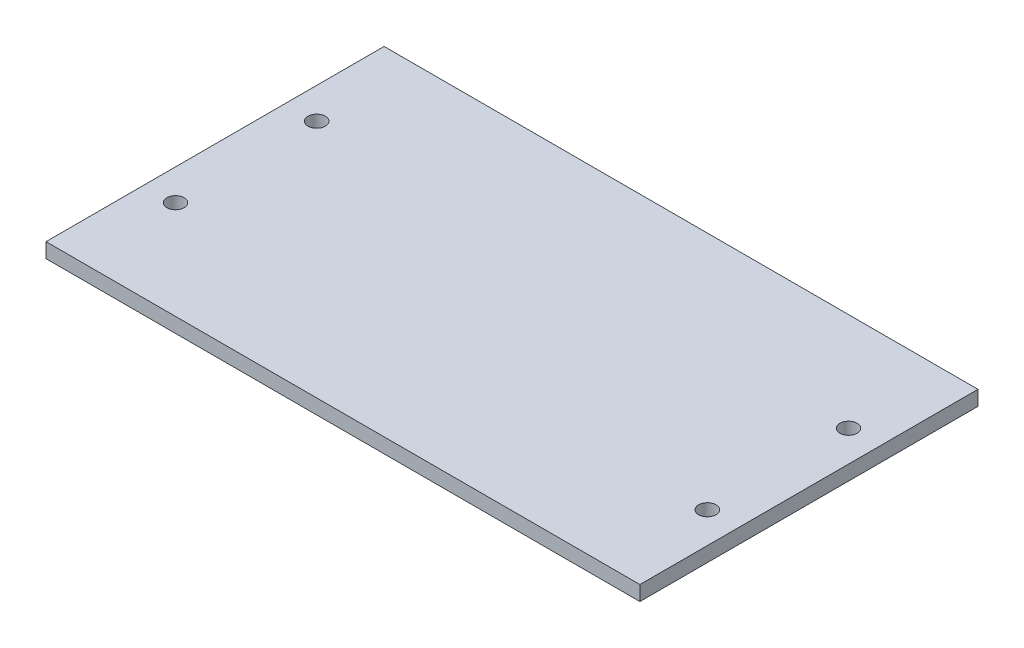
ISO-10303-21;
HEADER;
FILE_DESCRIPTION(('STEP AP214'),'2;1');
FILE_NAME('part.step','',(''),(''),'','','');
FILE_SCHEMA(('AUTOMOTIVE_DESIGN { 1 0 10303 214 1 1 1 1 }'));
ENDSEC;
DATA;
#1=APPLICATION_CONTEXT('core data for automotive mechanical design processes');
#2=APPLICATION_PROTOCOL_DEFINITION('international standard','automotive_design',2000,#1);
#3=PRODUCT_CONTEXT('',#1,'mechanical');
#4=PRODUCT('Part','Part','',(#3));
#5=PRODUCT_RELATED_PRODUCT_CATEGORY('part','',(#4));
#6=PRODUCT_DEFINITION_FORMATION('','',#4);
#7=PRODUCT_DEFINITION_CONTEXT('part definition',#1,'design');
#8=PRODUCT_DEFINITION('design','',#6,#7);
#9=PRODUCT_DEFINITION_SHAPE('','',#8);
#10=(LENGTH_UNIT() NAMED_UNIT(*) SI_UNIT(.MILLI.,.METRE.));
#11=(NAMED_UNIT(*) PLANE_ANGLE_UNIT() SI_UNIT($,.RADIAN.));
#12=(NAMED_UNIT(*) SI_UNIT($,.STERADIAN.) SOLID_ANGLE_UNIT());
#13=UNCERTAINTY_MEASURE_WITH_UNIT(LENGTH_MEASURE(1.E-05),#10,'distance_accuracy_value','');
#14=(GEOMETRIC_REPRESENTATION_CONTEXT(3) GLOBAL_UNCERTAINTY_ASSIGNED_CONTEXT((#13)) GLOBAL_UNIT_ASSIGNED_CONTEXT((#10,
#11,#12)) REPRESENTATION_CONTEXT('',''));
#15=CARTESIAN_POINT('',(0.,0.,0.));
#16=DIRECTION('',(0.,0.,1.));
#17=DIRECTION('',(1.,0.,0.));
#18=AXIS2_PLACEMENT_3D('',#15,#16,#17);
#19=CARTESIAN_POINT('',(0.,4.7625,0.));
#20=DIRECTION('',(0.,-1.,0.));
#21=DIRECTION('',(0.,0.,-1.));
#22=AXIS2_PLACEMENT_3D('',#19,#20,#21);
#23=PLANE('',#22);
#24=DIRECTION('',(0.,0.,1.));
#25=VECTOR('',#24,1.);
#26=CARTESIAN_POINT('',(0.,4.7625,0.));
#27=LINE('',#26,#25);
#28=CARTESIAN_POINT('',(0.,4.7625,-109.0295));
#29=VERTEX_POINT('',#28);
#30=CARTESIAN_POINT('',(0.,4.7625,0.));
#31=VERTEX_POINT('',#30);
#32=EDGE_CURVE('E88',#29,#31,#27,.T.);
#33=ORIENTED_EDGE('',*,*,#32,.T.);
#34=DIRECTION('',(1.,0.,0.));
#35=VECTOR('',#34,1.);
#36=CARTESIAN_POINT('',(0.,4.7625,0.));
#37=LINE('',#36,#35);
#38=CARTESIAN_POINT('',(191.516,4.7625,0.));
#39=VERTEX_POINT('',#38);
#40=EDGE_CURVE('E83',#31,#39,#37,.T.);
#41=ORIENTED_EDGE('',*,*,#40,.T.);
#42=DIRECTION('',(0.,0.,-1.));
#43=VECTOR('',#42,1.);
#44=CARTESIAN_POINT('',(191.516,4.7625,0.));
#45=LINE('',#44,#43);
#46=CARTESIAN_POINT('',(191.516,4.7625,-109.0295));
#47=VERTEX_POINT('',#46);
#48=EDGE_CURVE('E86',#39,#47,#45,.T.);
#49=ORIENTED_EDGE('',*,*,#48,.T.);
#50=DIRECTION('',(-1.,0.,0.));
#51=VECTOR('',#50,1.);
#52=CARTESIAN_POINT('',(0.,4.7625,-109.0295));
#53=LINE('',#52,#51);
#54=EDGE_CURVE('E53',#47,#29,#53,.T.);
#55=ORIENTED_EDGE('',*,*,#54,.T.);
#56=EDGE_LOOP('',(#33,#41,#49,#55));
#57=FACE_BOUND('',#56,.T.);
#58=CARTESIAN_POINT('',(10.0076,4.7625,-77.2795));
#59=DIRECTION('',(0.,1.,0.));
#60=DIRECTION('',(0.,0.,1.));
#61=AXIS2_PLACEMENT_3D('',#58,#59,#60);
#62=CIRCLE('',#61,2.79400000000001);
#63=CARTESIAN_POINT('',(10.0076,4.7625,-80.0735));
#64=VERTEX_POINT('',#63);
#65=EDGE_CURVE('E103',#64,#64,#62,.T.);
#66=ORIENTED_EDGE('',*,*,#65,.F.);
#67=EDGE_LOOP('',(#66));
#68=FACE_BOUND('',#67,.T.);
#69=CARTESIAN_POINT('',(10.0076,4.7625,-31.75));
#70=DIRECTION('',(0.,1.,0.));
#71=DIRECTION('',(0.,0.,1.));
#72=AXIS2_PLACEMENT_3D('',#69,#70,#71);
#73=CIRCLE('',#72,2.794);
#74=CARTESIAN_POINT('',(10.0076,4.7625,-34.544));
#75=VERTEX_POINT('',#74);
#76=EDGE_CURVE('E118',#75,#75,#73,.T.);
#77=ORIENTED_EDGE('',*,*,#76,.F.);
#78=EDGE_LOOP('',(#77));
#79=FACE_BOUND('',#78,.T.);
#80=CARTESIAN_POINT('',(181.5084,4.7625,-77.2795));
#81=DIRECTION('',(0.,1.,0.));
#82=DIRECTION('',(0.,0.,1.));
#83=AXIS2_PLACEMENT_3D('',#80,#81,#82);
#84=CIRCLE('',#83,2.79399999999998);
#85=CARTESIAN_POINT('',(181.5084,4.7625,-80.0735));
#86=VERTEX_POINT('',#85);
#87=EDGE_CURVE('E124',#86,#86,#84,.T.);
#88=ORIENTED_EDGE('',*,*,#87,.F.);
#89=EDGE_LOOP('',(#88));
#90=FACE_BOUND('',#89,.T.);
#91=CARTESIAN_POINT('',(181.5084,4.7625,-31.75));
#92=DIRECTION('',(0.,1.,0.));
#93=DIRECTION('',(0.,0.,1.));
#94=AXIS2_PLACEMENT_3D('',#91,#92,#93);
#95=CIRCLE('',#94,2.79399999999998);
#96=CARTESIAN_POINT('',(181.5084,4.7625,-34.544));
#97=VERTEX_POINT('',#96);
#98=EDGE_CURVE('E130',#97,#97,#95,.T.);
#99=ORIENTED_EDGE('',*,*,#98,.F.);
#100=EDGE_LOOP('',(#99));
#101=FACE_BOUND('',#100,.T.);
#102=ADVANCED_FACE('F36',(#57,#68,#79,#90,#101),#23,.F.);
#103=CARTESIAN_POINT('',(0.,0.,0.));
#104=DIRECTION('',(0.,-1.,0.));
#105=DIRECTION('',(0.,0.,-1.));
#106=AXIS2_PLACEMENT_3D('',#103,#104,#105);
#107=PLANE('',#106);
#108=CARTESIAN_POINT('',(181.5084,0.,-77.2795));
#109=DIRECTION('',(0.,1.,0.));
#110=DIRECTION('',(0.,0.,1.));
#111=AXIS2_PLACEMENT_3D('',#108,#109,#110);
#112=CIRCLE('',#111,2.79399999999998);
#113=CARTESIAN_POINT('',(181.5084,0.,-80.0735));
#114=VERTEX_POINT('',#113);
#115=EDGE_CURVE('E127',#114,#114,#112,.T.);
#116=ORIENTED_EDGE('',*,*,#115,.T.);
#117=EDGE_LOOP('',(#116));
#118=FACE_BOUND('',#117,.T.);
#119=CARTESIAN_POINT('',(10.0076,0.,-77.2795));
#120=DIRECTION('',(0.,1.,0.));
#121=DIRECTION('',(0.,0.,1.));
#122=AXIS2_PLACEMENT_3D('',#119,#120,#121);
#123=CIRCLE('',#122,2.79400000000001);
#124=CARTESIAN_POINT('',(10.0076,0.,-80.0735));
#125=VERTEX_POINT('',#124);
#126=EDGE_CURVE('E115',#125,#125,#123,.T.);
#127=ORIENTED_EDGE('',*,*,#126,.T.);
#128=EDGE_LOOP('',(#127));
#129=FACE_BOUND('',#128,.T.);
#130=DIRECTION('',(0.,0.,1.));
#131=VECTOR('',#130,1.);
#132=CARTESIAN_POINT('',(0.,0.,0.));
#133=LINE('',#132,#131);
#134=CARTESIAN_POINT('',(0.,0.,-109.0295));
#135=VERTEX_POINT('',#134);
#136=CARTESIAN_POINT('',(0.,0.,0.));
#137=VERTEX_POINT('',#136);
#138=EDGE_CURVE('E100',#135,#137,#133,.T.);
#139=ORIENTED_EDGE('',*,*,#138,.F.);
#140=DIRECTION('',(-1.,0.,0.));
#141=VECTOR('',#140,1.);
#142=CARTESIAN_POINT('',(0.,0.,-109.0295));
#143=LINE('',#142,#141);
#144=CARTESIAN_POINT('',(191.516,0.,-109.0295));
#145=VERTEX_POINT('',#144);
#146=EDGE_CURVE('E76',#145,#135,#143,.T.);
#147=ORIENTED_EDGE('',*,*,#146,.F.);
#148=DIRECTION('',(0.,0.,-1.));
#149=VECTOR('',#148,1.);
#150=CARTESIAN_POINT('',(191.516,0.,0.));
#151=LINE('',#150,#149);
#152=CARTESIAN_POINT('',(191.516,0.,0.));
#153=VERTEX_POINT('',#152);
#154=EDGE_CURVE('E70',#153,#145,#151,.T.);
#155=ORIENTED_EDGE('',*,*,#154,.F.);
#156=DIRECTION('',(1.,0.,0.));
#157=VECTOR('',#156,1.);
#158=CARTESIAN_POINT('',(0.,0.,0.));
#159=LINE('',#158,#157);
#160=EDGE_CURVE('E92',#137,#153,#159,.T.);
#161=ORIENTED_EDGE('',*,*,#160,.F.);
#162=EDGE_LOOP('',(#139,#147,#155,#161));
#163=FACE_BOUND('',#162,.T.);
#164=CARTESIAN_POINT('',(10.0076,0.,-31.75));
#165=DIRECTION('',(0.,1.,0.));
#166=DIRECTION('',(0.,0.,1.));
#167=AXIS2_PLACEMENT_3D('',#164,#165,#166);
#168=CIRCLE('',#167,2.794);
#169=CARTESIAN_POINT('',(10.0076,0.,-34.544));
#170=VERTEX_POINT('',#169);
#171=EDGE_CURVE('E121',#170,#170,#168,.T.);
#172=ORIENTED_EDGE('',*,*,#171,.T.);
#173=EDGE_LOOP('',(#172));
#174=FACE_BOUND('',#173,.T.);
#175=CARTESIAN_POINT('',(181.5084,0.,-31.75));
#176=DIRECTION('',(0.,1.,0.));
#177=DIRECTION('',(0.,0.,1.));
#178=AXIS2_PLACEMENT_3D('',#175,#176,#177);
#179=CIRCLE('',#178,2.79399999999998);
#180=CARTESIAN_POINT('',(181.5084,0.,-34.544));
#181=VERTEX_POINT('',#180);
#182=EDGE_CURVE('E133',#181,#181,#179,.T.);
#183=ORIENTED_EDGE('',*,*,#182,.T.);
#184=EDGE_LOOP('',(#183));
#185=FACE_BOUND('',#184,.T.);
#186=ADVANCED_FACE('F111',(#118,#129,#163,#174,#185),#107,.T.);
#187=CARTESIAN_POINT('',(0.,4.7625,0.));
#188=DIRECTION('',(1.,0.,0.));
#189=DIRECTION('',(0.,0.,-1.));
#190=AXIS2_PLACEMENT_3D('',#187,#188,#189);
#191=PLANE('',#190);
#192=ORIENTED_EDGE('',*,*,#138,.T.);
#193=DIRECTION('',(0.,-1.,0.));
#194=VECTOR('',#193,1.);
#195=CARTESIAN_POINT('',(0.,4.7625,0.));
#196=LINE('',#195,#194);
#197=EDGE_CURVE('E11',#31,#137,#196,.T.);
#198=ORIENTED_EDGE('',*,*,#197,.F.);
#199=ORIENTED_EDGE('',*,*,#32,.F.);
#200=DIRECTION('',(0.,-1.,0.));
#201=VECTOR('',#200,1.);
#202=CARTESIAN_POINT('',(0.,4.7625,-109.0295));
#203=LINE('',#202,#201);
#204=EDGE_CURVE('E96',#29,#135,#203,.T.);
#205=ORIENTED_EDGE('',*,*,#204,.T.);
#206=EDGE_LOOP('',(#192,#198,#199,#205));
#207=FACE_BOUND('',#206,.T.);
#208=ADVANCED_FACE('F38',(#207),#191,.F.);
#209=CARTESIAN_POINT('',(0.,4.7625,0.));
#210=DIRECTION('',(0.,0.,-1.));
#211=DIRECTION('',(-1.,0.,0.));
#212=AXIS2_PLACEMENT_3D('',#209,#210,#211);
#213=PLANE('',#212);
#214=ORIENTED_EDGE('',*,*,#160,.T.);
#215=DIRECTION('',(0.,-1.,0.));
#216=VECTOR('',#215,1.);
#217=CARTESIAN_POINT('',(191.516,4.7625,0.));
#218=LINE('',#217,#216);
#219=EDGE_CURVE('E45',#39,#153,#218,.T.);
#220=ORIENTED_EDGE('',*,*,#219,.F.);
#221=ORIENTED_EDGE('',*,*,#40,.F.);
#222=ORIENTED_EDGE('',*,*,#197,.T.);
#223=EDGE_LOOP('',(#214,#220,#221,#222));
#224=FACE_BOUND('',#223,.T.);
#225=ADVANCED_FACE('F91',(#224),#213,.F.);
#226=CARTESIAN_POINT('',(191.516,4.7625,0.));
#227=DIRECTION('',(-1.,0.,0.));
#228=DIRECTION('',(0.,0.,1.));
#229=AXIS2_PLACEMENT_3D('',#226,#227,#228);
#230=PLANE('',#229);
#231=ORIENTED_EDGE('',*,*,#154,.T.);
#232=DIRECTION('',(0.,-1.,0.));
#233=VECTOR('',#232,1.);
#234=CARTESIAN_POINT('',(191.516,4.7625,-109.0295));
#235=LINE('',#234,#233);
#236=EDGE_CURVE('E93',#47,#145,#235,.T.);
#237=ORIENTED_EDGE('',*,*,#236,.F.);
#238=ORIENTED_EDGE('',*,*,#48,.F.);
#239=ORIENTED_EDGE('',*,*,#219,.T.);
#240=EDGE_LOOP('',(#231,#237,#238,#239));
#241=FACE_BOUND('',#240,.T.);
#242=ADVANCED_FACE('F94',(#241),#230,.F.);
#243=CARTESIAN_POINT('',(0.,4.7625,-109.0295));
#244=DIRECTION('',(0.,0.,1.));
#245=DIRECTION('',(1.,0.,0.));
#246=AXIS2_PLACEMENT_3D('',#243,#244,#245);
#247=PLANE('',#246);
#248=ORIENTED_EDGE('',*,*,#146,.T.);
#249=ORIENTED_EDGE('',*,*,#204,.F.);
#250=ORIENTED_EDGE('',*,*,#54,.F.);
#251=ORIENTED_EDGE('',*,*,#236,.T.);
#252=EDGE_LOOP('',(#248,#249,#250,#251));
#253=FACE_BOUND('',#252,.T.);
#254=ADVANCED_FACE('F108',(#253),#247,.F.);
#255=CARTESIAN_POINT('',(10.0076,4.7625,-77.2795));
#256=DIRECTION('',(0.,-1.,0.));
#257=DIRECTION('',(0.,0.,-1.));
#258=AXIS2_PLACEMENT_3D('',#255,#256,#257);
#259=CYLINDRICAL_SURFACE('',#258,2.79400000000001);
#260=CARTESIAN_POINT('',(10.0076,4.7625,-80.0735));
#261=CARTESIAN_POINT('',(10.0076,4.712890625,-80.0735));
#262=CARTESIAN_POINT('',(10.0076,4.66328125,-80.0735));
#263=CARTESIAN_POINT('',(10.0076,4.5640625,-80.0735));
#264=CARTESIAN_POINT('',(10.0076,4.514453125,-80.0735));
#265=CARTESIAN_POINT('',(10.0076,4.415234375,-80.0735));
#266=CARTESIAN_POINT('',(10.0076,4.365625,-80.0735));
#267=CARTESIAN_POINT('',(10.0076,4.26640625,-80.0735));
#268=CARTESIAN_POINT('',(10.0076,4.216796875,-80.0735));
#269=CARTESIAN_POINT('',(10.0076,4.117578125,-80.0735));
#270=CARTESIAN_POINT('',(10.0076,4.06796875,-80.0735));
#271=CARTESIAN_POINT('',(10.0076,3.96875,-80.0735));
#272=CARTESIAN_POINT('',(10.0076,3.919140625,-80.0735));
#273=CARTESIAN_POINT('',(10.0076,3.819921875,-80.0735));
#274=CARTESIAN_POINT('',(10.0076,3.7703125,-80.0735));
#275=CARTESIAN_POINT('',(10.0076,3.67109375,-80.0735));
#276=CARTESIAN_POINT('',(10.0076,3.621484375,-80.0735));
#277=CARTESIAN_POINT('',(10.0076,3.522265625,-80.0735));
#278=CARTESIAN_POINT('',(10.0076,3.47265625,-80.0735));
#279=CARTESIAN_POINT('',(10.0076,3.3734375,-80.0735));
#280=CARTESIAN_POINT('',(10.0076,3.323828125,-80.0735));
#281=CARTESIAN_POINT('',(10.0076,3.224609375,-80.0735));
#282=CARTESIAN_POINT('',(10.0076,3.175,-80.0735));
#283=CARTESIAN_POINT('',(10.0076,3.07578125,-80.0735));
#284=CARTESIAN_POINT('',(10.0076,3.026171875,-80.0735));
#285=CARTESIAN_POINT('',(10.0076,2.926953125,-80.0735));
#286=CARTESIAN_POINT('',(10.0076,2.87734375,-80.0735));
#287=CARTESIAN_POINT('',(10.0076,2.778125,-80.0735));
#288=CARTESIAN_POINT('',(10.0076,2.728515625,-80.0735));
#289=CARTESIAN_POINT('',(10.0076,2.629296875,-80.0735));
#290=CARTESIAN_POINT('',(10.0076,2.5796875,-80.0735));
#291=CARTESIAN_POINT('',(10.0076,2.48046875,-80.0735));
#292=CARTESIAN_POINT('',(10.0076,2.430859375,-80.0735));
#293=CARTESIAN_POINT('',(10.0076,2.331640625,-80.0735));
#294=CARTESIAN_POINT('',(10.0076,2.28203125,-80.0735));
#295=CARTESIAN_POINT('',(10.0076,2.1828125,-80.0735));
#296=CARTESIAN_POINT('',(10.0076,2.133203125,-80.0735));
#297=CARTESIAN_POINT('',(10.0076,2.033984375,-80.0735));
#298=CARTESIAN_POINT('',(10.0076,1.984375,-80.0735));
#299=CARTESIAN_POINT('',(10.0076,1.88515625,-80.0735));
#300=CARTESIAN_POINT('',(10.0076,1.835546875,-80.0735));
#301=CARTESIAN_POINT('',(10.0076,1.736328125,-80.0735));
#302=CARTESIAN_POINT('',(10.0076,1.68671875,-80.0735));
#303=CARTESIAN_POINT('',(10.0076,1.5875,-80.0735));
#304=CARTESIAN_POINT('',(10.0076,1.537890625,-80.0735));
#305=CARTESIAN_POINT('',(10.0076,1.438671875,-80.0735));
#306=CARTESIAN_POINT('',(10.0076,1.3890625,-80.0735));
#307=CARTESIAN_POINT('',(10.0076,1.28984375,-80.0735));
#308=CARTESIAN_POINT('',(10.0076,1.240234375,-80.0735));
#309=CARTESIAN_POINT('',(10.0076,1.141015625,-80.0735));
#310=CARTESIAN_POINT('',(10.0076,1.09140625,-80.0735));
#311=CARTESIAN_POINT('',(10.0076,0.9921875,-80.0735));
#312=CARTESIAN_POINT('',(10.0076,0.942578125,-80.0735));
#313=CARTESIAN_POINT('',(10.0076,0.843359375,-80.0735));
#314=CARTESIAN_POINT('',(10.0076,0.79375,-80.0735));
#315=CARTESIAN_POINT('',(10.0076,0.69453125,-80.0735));
#316=CARTESIAN_POINT('',(10.0076,0.644921875,-80.0735));
#317=CARTESIAN_POINT('',(10.0076,0.545703125,-80.0735));
#318=CARTESIAN_POINT('',(10.0076,0.49609375,-80.0735));
#319=CARTESIAN_POINT('',(10.0076,0.396875,-80.0735));
#320=CARTESIAN_POINT('',(10.0076,0.347265625,-80.0735));
#321=CARTESIAN_POINT('',(10.0076,0.248046875,-80.0735));
#322=CARTESIAN_POINT('',(10.0076,0.1984375,-80.0735));
#323=CARTESIAN_POINT('',(10.0076,0.09921875,-80.0735));
#324=CARTESIAN_POINT('',(10.0076,0.049609375,-80.0735));
#325=CARTESIAN_POINT('',(10.0076,0.,-80.0735));
#326=B_SPLINE_CURVE_WITH_KNOTS('',3,(#260,#261,#262,#263,#264,#265,#266,#267,#268,#269,#270,
#271,#272,#273,#274,#275,#276,#277,#278,#279,#280,#281,#282,#283,#284,#285,#286,#287,#288,#289,
#290,#291,#292,#293,#294,#295,#296,#297,#298,#299,#300,#301,#302,#303,#304,#305,#306,#307,#308,
#309,#310,#311,#312,#313,#314,#315,#316,#317,#318,#319,#320,#321,#322,#323,#324,#325),
.UNSPECIFIED.,.F.,.F.,(4,2,2,2,2,2,2,2,2,2,2,2,2,2,2,2,2,2,2,2,2,2,2,2,2,2,2,2,2,2,2,2,4),(0.,
0.148828124999999,0.297656249999999,0.446484374999999,0.595312499999999,0.744140625,0.89296875,
1.041796875,1.190625,1.339453125,1.48828125,1.637109375,1.7859375,1.934765625,2.08359375,
2.232421875,2.38125,2.530078125,2.67890625,2.827734375,2.9765625,3.125390625,3.27421875,
3.423046875,3.571875,3.720703125,3.86953125,4.018359375,4.1671875,4.316015625,4.46484375,
4.613671875,4.7625),.UNSPECIFIED.);
#327=EDGE_CURVE('BSEAM150',#64,#125,#326,.T.);
#328=ORIENTED_EDGE('',*,*,#65,.T.);
#329=ORIENTED_EDGE('',*,*,#126,.F.);
#330=ORIENTED_EDGE('',*,*,#327,.T.);
#331=ORIENTED_EDGE('',*,*,#327,.F.);
#332=EDGE_LOOP('',(#328,#330,#329,#331));
#333=FACE_BOUND('',#332,.T.);
#334=ADVANCED_FACE('F150',(#333),#259,.F.);
#335=CARTESIAN_POINT('',(10.0076,4.7625,-31.75));
#336=DIRECTION('',(0.,-1.,0.));
#337=DIRECTION('',(0.,0.,-1.));
#338=AXIS2_PLACEMENT_3D('',#335,#336,#337);
#339=CYLINDRICAL_SURFACE('',#338,2.794);
#340=CARTESIAN_POINT('',(10.0076,4.7625,-34.544));
#341=CARTESIAN_POINT('',(10.0076,4.712890625,-34.544));
#342=CARTESIAN_POINT('',(10.0076,4.66328125,-34.544));
#343=CARTESIAN_POINT('',(10.0076,4.5640625,-34.544));
#344=CARTESIAN_POINT('',(10.0076,4.514453125,-34.544));
#345=CARTESIAN_POINT('',(10.0076,4.415234375,-34.544));
#346=CARTESIAN_POINT('',(10.0076,4.365625,-34.544));
#347=CARTESIAN_POINT('',(10.0076,4.26640625,-34.544));
#348=CARTESIAN_POINT('',(10.0076,4.216796875,-34.544));
#349=CARTESIAN_POINT('',(10.0076,4.117578125,-34.544));
#350=CARTESIAN_POINT('',(10.0076,4.06796875,-34.544));
#351=CARTESIAN_POINT('',(10.0076,3.96875,-34.544));
#352=CARTESIAN_POINT('',(10.0076,3.919140625,-34.544));
#353=CARTESIAN_POINT('',(10.0076,3.819921875,-34.544));
#354=CARTESIAN_POINT('',(10.0076,3.7703125,-34.544));
#355=CARTESIAN_POINT('',(10.0076,3.67109375,-34.544));
#356=CARTESIAN_POINT('',(10.0076,3.621484375,-34.544));
#357=CARTESIAN_POINT('',(10.0076,3.522265625,-34.544));
#358=CARTESIAN_POINT('',(10.0076,3.47265625,-34.544));
#359=CARTESIAN_POINT('',(10.0076,3.3734375,-34.544));
#360=CARTESIAN_POINT('',(10.0076,3.323828125,-34.544));
#361=CARTESIAN_POINT('',(10.0076,3.224609375,-34.544));
#362=CARTESIAN_POINT('',(10.0076,3.175,-34.544));
#363=CARTESIAN_POINT('',(10.0076,3.07578125,-34.544));
#364=CARTESIAN_POINT('',(10.0076,3.026171875,-34.544));
#365=CARTESIAN_POINT('',(10.0076,2.926953125,-34.544));
#366=CARTESIAN_POINT('',(10.0076,2.87734375,-34.544));
#367=CARTESIAN_POINT('',(10.0076,2.778125,-34.544));
#368=CARTESIAN_POINT('',(10.0076,2.728515625,-34.544));
#369=CARTESIAN_POINT('',(10.0076,2.629296875,-34.544));
#370=CARTESIAN_POINT('',(10.0076,2.5796875,-34.544));
#371=CARTESIAN_POINT('',(10.0076,2.48046875,-34.544));
#372=CARTESIAN_POINT('',(10.0076,2.430859375,-34.544));
#373=CARTESIAN_POINT('',(10.0076,2.331640625,-34.544));
#374=CARTESIAN_POINT('',(10.0076,2.28203125,-34.544));
#375=CARTESIAN_POINT('',(10.0076,2.1828125,-34.544));
#376=CARTESIAN_POINT('',(10.0076,2.133203125,-34.544));
#377=CARTESIAN_POINT('',(10.0076,2.033984375,-34.544));
#378=CARTESIAN_POINT('',(10.0076,1.984375,-34.544));
#379=CARTESIAN_POINT('',(10.0076,1.88515625,-34.544));
#380=CARTESIAN_POINT('',(10.0076,1.835546875,-34.544));
#381=CARTESIAN_POINT('',(10.0076,1.736328125,-34.544));
#382=CARTESIAN_POINT('',(10.0076,1.68671875,-34.544));
#383=CARTESIAN_POINT('',(10.0076,1.5875,-34.544));
#384=CARTESIAN_POINT('',(10.0076,1.537890625,-34.544));
#385=CARTESIAN_POINT('',(10.0076,1.438671875,-34.544));
#386=CARTESIAN_POINT('',(10.0076,1.3890625,-34.544));
#387=CARTESIAN_POINT('',(10.0076,1.28984375,-34.544));
#388=CARTESIAN_POINT('',(10.0076,1.240234375,-34.544));
#389=CARTESIAN_POINT('',(10.0076,1.141015625,-34.544));
#390=CARTESIAN_POINT('',(10.0076,1.09140625,-34.544));
#391=CARTESIAN_POINT('',(10.0076,0.9921875,-34.544));
#392=CARTESIAN_POINT('',(10.0076,0.942578125,-34.544));
#393=CARTESIAN_POINT('',(10.0076,0.843359375,-34.544));
#394=CARTESIAN_POINT('',(10.0076,0.79375,-34.544));
#395=CARTESIAN_POINT('',(10.0076,0.69453125,-34.544));
#396=CARTESIAN_POINT('',(10.0076,0.644921875,-34.544));
#397=CARTESIAN_POINT('',(10.0076,0.545703125,-34.544));
#398=CARTESIAN_POINT('',(10.0076,0.49609375,-34.544));
#399=CARTESIAN_POINT('',(10.0076,0.396875,-34.544));
#400=CARTESIAN_POINT('',(10.0076,0.347265625,-34.544));
#401=CARTESIAN_POINT('',(10.0076,0.248046875,-34.544));
#402=CARTESIAN_POINT('',(10.0076,0.1984375,-34.544));
#403=CARTESIAN_POINT('',(10.0076,0.09921875,-34.544));
#404=CARTESIAN_POINT('',(10.0076,0.049609375,-34.544));
#405=CARTESIAN_POINT('',(10.0076,0.,-34.544));
#406=B_SPLINE_CURVE_WITH_KNOTS('',3,(#340,#341,#342,#343,#344,#345,#346,#347,#348,#349,#350,
#351,#352,#353,#354,#355,#356,#357,#358,#359,#360,#361,#362,#363,#364,#365,#366,#367,#368,#369,
#370,#371,#372,#373,#374,#375,#376,#377,#378,#379,#380,#381,#382,#383,#384,#385,#386,#387,#388,
#389,#390,#391,#392,#393,#394,#395,#396,#397,#398,#399,#400,#401,#402,#403,#404,#405),
.UNSPECIFIED.,.F.,.F.,(4,2,2,2,2,2,2,2,2,2,2,2,2,2,2,2,2,2,2,2,2,2,2,2,2,2,2,2,2,2,2,2,4),(0.,
0.148828124999999,0.297656249999999,0.446484374999999,0.595312499999999,0.744140625,0.89296875,
1.041796875,1.190625,1.339453125,1.48828125,1.637109375,1.7859375,1.934765625,2.08359375,
2.232421875,2.38125,2.530078125,2.67890625,2.827734375,2.9765625,3.125390625,3.27421875,
3.423046875,3.571875,3.720703125,3.86953125,4.018359375,4.1671875,4.316015625,4.46484375,
4.613671875,4.7625),.UNSPECIFIED.);
#407=EDGE_CURVE('BSEAM204',#75,#170,#406,.T.);
#408=ORIENTED_EDGE('',*,*,#76,.T.);
#409=ORIENTED_EDGE('',*,*,#171,.F.);
#410=ORIENTED_EDGE('',*,*,#407,.T.);
#411=ORIENTED_EDGE('',*,*,#407,.F.);
#412=EDGE_LOOP('',(#408,#410,#409,#411));
#413=FACE_BOUND('',#412,.T.);
#414=ADVANCED_FACE('F204',(#413),#339,.F.);
#415=CARTESIAN_POINT('',(181.5084,4.7625,-77.2795));
#416=DIRECTION('',(0.,-1.,0.));
#417=DIRECTION('',(0.,0.,-1.));
#418=AXIS2_PLACEMENT_3D('',#415,#416,#417);
#419=CYLINDRICAL_SURFACE('',#418,2.79399999999998);
#420=CARTESIAN_POINT('',(181.5084,4.7625,-80.0735));
#421=CARTESIAN_POINT('',(181.5084,4.712890625,-80.0735));
#422=CARTESIAN_POINT('',(181.5084,4.66328125,-80.0735));
#423=CARTESIAN_POINT('',(181.5084,4.5640625,-80.0735));
#424=CARTESIAN_POINT('',(181.5084,4.514453125,-80.0735));
#425=CARTESIAN_POINT('',(181.5084,4.415234375,-80.0735));
#426=CARTESIAN_POINT('',(181.5084,4.365625,-80.0735));
#427=CARTESIAN_POINT('',(181.5084,4.26640625,-80.0735));
#428=CARTESIAN_POINT('',(181.5084,4.216796875,-80.0735));
#429=CARTESIAN_POINT('',(181.5084,4.117578125,-80.0735));
#430=CARTESIAN_POINT('',(181.5084,4.06796875,-80.0735));
#431=CARTESIAN_POINT('',(181.5084,3.96875,-80.0735));
#432=CARTESIAN_POINT('',(181.5084,3.919140625,-80.0735));
#433=CARTESIAN_POINT('',(181.5084,3.819921875,-80.0735));
#434=CARTESIAN_POINT('',(181.5084,3.7703125,-80.0735));
#435=CARTESIAN_POINT('',(181.5084,3.67109375,-80.0735));
#436=CARTESIAN_POINT('',(181.5084,3.621484375,-80.0735));
#437=CARTESIAN_POINT('',(181.5084,3.522265625,-80.0735));
#438=CARTESIAN_POINT('',(181.5084,3.47265625,-80.0735));
#439=CARTESIAN_POINT('',(181.5084,3.3734375,-80.0735));
#440=CARTESIAN_POINT('',(181.5084,3.323828125,-80.0735));
#441=CARTESIAN_POINT('',(181.5084,3.224609375,-80.0735));
#442=CARTESIAN_POINT('',(181.5084,3.175,-80.0735));
#443=CARTESIAN_POINT('',(181.5084,3.07578125,-80.0735));
#444=CARTESIAN_POINT('',(181.5084,3.026171875,-80.0735));
#445=CARTESIAN_POINT('',(181.5084,2.926953125,-80.0735));
#446=CARTESIAN_POINT('',(181.5084,2.87734375,-80.0735));
#447=CARTESIAN_POINT('',(181.5084,2.778125,-80.0735));
#448=CARTESIAN_POINT('',(181.5084,2.728515625,-80.0735));
#449=CARTESIAN_POINT('',(181.5084,2.629296875,-80.0735));
#450=CARTESIAN_POINT('',(181.5084,2.5796875,-80.0735));
#451=CARTESIAN_POINT('',(181.5084,2.48046875,-80.0735));
#452=CARTESIAN_POINT('',(181.5084,2.430859375,-80.0735));
#453=CARTESIAN_POINT('',(181.5084,2.331640625,-80.0735));
#454=CARTESIAN_POINT('',(181.5084,2.28203125,-80.0735));
#455=CARTESIAN_POINT('',(181.5084,2.1828125,-80.0735));
#456=CARTESIAN_POINT('',(181.5084,2.133203125,-80.0735));
#457=CARTESIAN_POINT('',(181.5084,2.033984375,-80.0735));
#458=CARTESIAN_POINT('',(181.5084,1.984375,-80.0735));
#459=CARTESIAN_POINT('',(181.5084,1.88515625,-80.0735));
#460=CARTESIAN_POINT('',(181.5084,1.835546875,-80.0735));
#461=CARTESIAN_POINT('',(181.5084,1.736328125,-80.0735));
#462=CARTESIAN_POINT('',(181.5084,1.68671875,-80.0735));
#463=CARTESIAN_POINT('',(181.5084,1.5875,-80.0735));
#464=CARTESIAN_POINT('',(181.5084,1.537890625,-80.0735));
#465=CARTESIAN_POINT('',(181.5084,1.438671875,-80.0735));
#466=CARTESIAN_POINT('',(181.5084,1.3890625,-80.0735));
#467=CARTESIAN_POINT('',(181.5084,1.28984375,-80.0735));
#468=CARTESIAN_POINT('',(181.5084,1.240234375,-80.0735));
#469=CARTESIAN_POINT('',(181.5084,1.141015625,-80.0735));
#470=CARTESIAN_POINT('',(181.5084,1.09140625,-80.0735));
#471=CARTESIAN_POINT('',(181.5084,0.9921875,-80.0735));
#472=CARTESIAN_POINT('',(181.5084,0.942578125,-80.0735));
#473=CARTESIAN_POINT('',(181.5084,0.843359375,-80.0735));
#474=CARTESIAN_POINT('',(181.5084,0.79375,-80.0735));
#475=CARTESIAN_POINT('',(181.5084,0.69453125,-80.0735));
#476=CARTESIAN_POINT('',(181.5084,0.644921875,-80.0735));
#477=CARTESIAN_POINT('',(181.5084,0.545703125,-80.0735));
#478=CARTESIAN_POINT('',(181.5084,0.49609375,-80.0735));
#479=CARTESIAN_POINT('',(181.5084,0.396875,-80.0735));
#480=CARTESIAN_POINT('',(181.5084,0.347265625,-80.0735));
#481=CARTESIAN_POINT('',(181.5084,0.248046875,-80.0735));
#482=CARTESIAN_POINT('',(181.5084,0.1984375,-80.0735));
#483=CARTESIAN_POINT('',(181.5084,0.09921875,-80.0735));
#484=CARTESIAN_POINT('',(181.5084,0.049609375,-80.0735));
#485=CARTESIAN_POINT('',(181.5084,0.,-80.0735));
#486=B_SPLINE_CURVE_WITH_KNOTS('',3,(#420,#421,#422,#423,#424,#425,#426,#427,#428,#429,#430,
#431,#432,#433,#434,#435,#436,#437,#438,#439,#440,#441,#442,#443,#444,#445,#446,#447,#448,#449,
#450,#451,#452,#453,#454,#455,#456,#457,#458,#459,#460,#461,#462,#463,#464,#465,#466,#467,#468,
#469,#470,#471,#472,#473,#474,#475,#476,#477,#478,#479,#480,#481,#482,#483,#484,#485),
.UNSPECIFIED.,.F.,.F.,(4,2,2,2,2,2,2,2,2,2,2,2,2,2,2,2,2,2,2,2,2,2,2,2,2,2,2,2,2,2,2,2,4),(0.,
0.148828124999999,0.297656249999999,0.446484374999999,0.595312499999999,0.744140625,0.89296875,
1.041796875,1.190625,1.339453125,1.48828125,1.637109375,1.7859375,1.934765625,2.08359375,
2.232421875,2.38125,2.530078125,2.67890625,2.827734375,2.9765625,3.125390625,3.27421875,
3.423046875,3.571875,3.720703125,3.86953125,4.018359375,4.1671875,4.316015625,4.46484375,
4.613671875,4.7625),.UNSPECIFIED.);
#487=EDGE_CURVE('BSEAM213',#86,#114,#486,.T.);
#488=ORIENTED_EDGE('',*,*,#87,.T.);
#489=ORIENTED_EDGE('',*,*,#115,.F.);
#490=ORIENTED_EDGE('',*,*,#487,.T.);
#491=ORIENTED_EDGE('',*,*,#487,.F.);
#492=EDGE_LOOP('',(#488,#490,#489,#491));
#493=FACE_BOUND('',#492,.T.);
#494=ADVANCED_FACE('F213',(#493),#419,.F.);
#495=CARTESIAN_POINT('',(181.5084,4.7625,-31.75));
#496=DIRECTION('',(0.,-1.,0.));
#497=DIRECTION('',(0.,0.,-1.));
#498=AXIS2_PLACEMENT_3D('',#495,#496,#497);
#499=CYLINDRICAL_SURFACE('',#498,2.79399999999998);
#500=CARTESIAN_POINT('',(181.5084,4.7625,-34.544));
#501=CARTESIAN_POINT('',(181.5084,4.712890625,-34.544));
#502=CARTESIAN_POINT('',(181.5084,4.66328125,-34.544));
#503=CARTESIAN_POINT('',(181.5084,4.5640625,-34.544));
#504=CARTESIAN_POINT('',(181.5084,4.514453125,-34.544));
#505=CARTESIAN_POINT('',(181.5084,4.415234375,-34.544));
#506=CARTESIAN_POINT('',(181.5084,4.365625,-34.544));
#507=CARTESIAN_POINT('',(181.5084,4.26640625,-34.544));
#508=CARTESIAN_POINT('',(181.5084,4.216796875,-34.544));
#509=CARTESIAN_POINT('',(181.5084,4.117578125,-34.544));
#510=CARTESIAN_POINT('',(181.5084,4.06796875,-34.544));
#511=CARTESIAN_POINT('',(181.5084,3.96875,-34.544));
#512=CARTESIAN_POINT('',(181.5084,3.919140625,-34.544));
#513=CARTESIAN_POINT('',(181.5084,3.819921875,-34.544));
#514=CARTESIAN_POINT('',(181.5084,3.7703125,-34.544));
#515=CARTESIAN_POINT('',(181.5084,3.67109375,-34.544));
#516=CARTESIAN_POINT('',(181.5084,3.621484375,-34.544));
#517=CARTESIAN_POINT('',(181.5084,3.522265625,-34.544));
#518=CARTESIAN_POINT('',(181.5084,3.47265625,-34.544));
#519=CARTESIAN_POINT('',(181.5084,3.3734375,-34.544));
#520=CARTESIAN_POINT('',(181.5084,3.323828125,-34.544));
#521=CARTESIAN_POINT('',(181.5084,3.224609375,-34.544));
#522=CARTESIAN_POINT('',(181.5084,3.175,-34.544));
#523=CARTESIAN_POINT('',(181.5084,3.07578125,-34.544));
#524=CARTESIAN_POINT('',(181.5084,3.026171875,-34.544));
#525=CARTESIAN_POINT('',(181.5084,2.926953125,-34.544));
#526=CARTESIAN_POINT('',(181.5084,2.87734375,-34.544));
#527=CARTESIAN_POINT('',(181.5084,2.778125,-34.544));
#528=CARTESIAN_POINT('',(181.5084,2.728515625,-34.544));
#529=CARTESIAN_POINT('',(181.5084,2.629296875,-34.544));
#530=CARTESIAN_POINT('',(181.5084,2.5796875,-34.544));
#531=CARTESIAN_POINT('',(181.5084,2.48046875,-34.544));
#532=CARTESIAN_POINT('',(181.5084,2.430859375,-34.544));
#533=CARTESIAN_POINT('',(181.5084,2.331640625,-34.544));
#534=CARTESIAN_POINT('',(181.5084,2.28203125,-34.544));
#535=CARTESIAN_POINT('',(181.5084,2.1828125,-34.544));
#536=CARTESIAN_POINT('',(181.5084,2.133203125,-34.544));
#537=CARTESIAN_POINT('',(181.5084,2.033984375,-34.544));
#538=CARTESIAN_POINT('',(181.5084,1.984375,-34.544));
#539=CARTESIAN_POINT('',(181.5084,1.88515625,-34.544));
#540=CARTESIAN_POINT('',(181.5084,1.835546875,-34.544));
#541=CARTESIAN_POINT('',(181.5084,1.736328125,-34.544));
#542=CARTESIAN_POINT('',(181.5084,1.68671875,-34.544));
#543=CARTESIAN_POINT('',(181.5084,1.5875,-34.544));
#544=CARTESIAN_POINT('',(181.5084,1.537890625,-34.544));
#545=CARTESIAN_POINT('',(181.5084,1.438671875,-34.544));
#546=CARTESIAN_POINT('',(181.5084,1.3890625,-34.544));
#547=CARTESIAN_POINT('',(181.5084,1.28984375,-34.544));
#548=CARTESIAN_POINT('',(181.5084,1.240234375,-34.544));
#549=CARTESIAN_POINT('',(181.5084,1.141015625,-34.544));
#550=CARTESIAN_POINT('',(181.5084,1.09140625,-34.544));
#551=CARTESIAN_POINT('',(181.5084,0.9921875,-34.544));
#552=CARTESIAN_POINT('',(181.5084,0.942578125,-34.544));
#553=CARTESIAN_POINT('',(181.5084,0.843359375,-34.544));
#554=CARTESIAN_POINT('',(181.5084,0.79375,-34.544));
#555=CARTESIAN_POINT('',(181.5084,0.69453125,-34.544));
#556=CARTESIAN_POINT('',(181.5084,0.644921875,-34.544));
#557=CARTESIAN_POINT('',(181.5084,0.545703125,-34.544));
#558=CARTESIAN_POINT('',(181.5084,0.49609375,-34.544));
#559=CARTESIAN_POINT('',(181.5084,0.396875,-34.544));
#560=CARTESIAN_POINT('',(181.5084,0.347265625,-34.544));
#561=CARTESIAN_POINT('',(181.5084,0.248046875,-34.544));
#562=CARTESIAN_POINT('',(181.5084,0.1984375,-34.544));
#563=CARTESIAN_POINT('',(181.5084,0.09921875,-34.544));
#564=CARTESIAN_POINT('',(181.5084,0.049609375,-34.544));
#565=CARTESIAN_POINT('',(181.5084,0.,-34.544));
#566=B_SPLINE_CURVE_WITH_KNOTS('',3,(#500,#501,#502,#503,#504,#505,#506,#507,#508,#509,#510,
#511,#512,#513,#514,#515,#516,#517,#518,#519,#520,#521,#522,#523,#524,#525,#526,#527,#528,#529,
#530,#531,#532,#533,#534,#535,#536,#537,#538,#539,#540,#541,#542,#543,#544,#545,#546,#547,#548,
#549,#550,#551,#552,#553,#554,#555,#556,#557,#558,#559,#560,#561,#562,#563,#564,#565),
.UNSPECIFIED.,.F.,.F.,(4,2,2,2,2,2,2,2,2,2,2,2,2,2,2,2,2,2,2,2,2,2,2,2,2,2,2,2,2,2,2,2,4),(0.,
0.148828124999999,0.297656249999999,0.446484374999999,0.595312499999999,0.744140625,0.89296875,
1.041796875,1.190625,1.339453125,1.48828125,1.637109375,1.7859375,1.934765625,2.08359375,
2.232421875,2.38125,2.530078125,2.67890625,2.827734375,2.9765625,3.125390625,3.27421875,
3.423046875,3.571875,3.720703125,3.86953125,4.018359375,4.1671875,4.316015625,4.46484375,
4.613671875,4.7625),.UNSPECIFIED.);
#567=EDGE_CURVE('BSEAM139',#97,#181,#566,.T.);
#568=ORIENTED_EDGE('',*,*,#98,.T.);
#569=ORIENTED_EDGE('',*,*,#182,.F.);
#570=ORIENTED_EDGE('',*,*,#567,.T.);
#571=ORIENTED_EDGE('',*,*,#567,.F.);
#572=EDGE_LOOP('',(#568,#570,#569,#571));
#573=FACE_BOUND('',#572,.T.);
#574=ADVANCED_FACE('F139',(#573),#499,.F.);
#575=CLOSED_SHELL('',(#102,#186,#208,#225,#242,#254,#334,#414,#494,#574));
#576=MANIFOLD_SOLID_BREP('B2',#575);
#577=ADVANCED_BREP_SHAPE_REPRESENTATION('',(#18,#576),#14);
#578=SHAPE_DEFINITION_REPRESENTATION(#9,#577);
ENDSEC;
END-ISO-10303-21;
